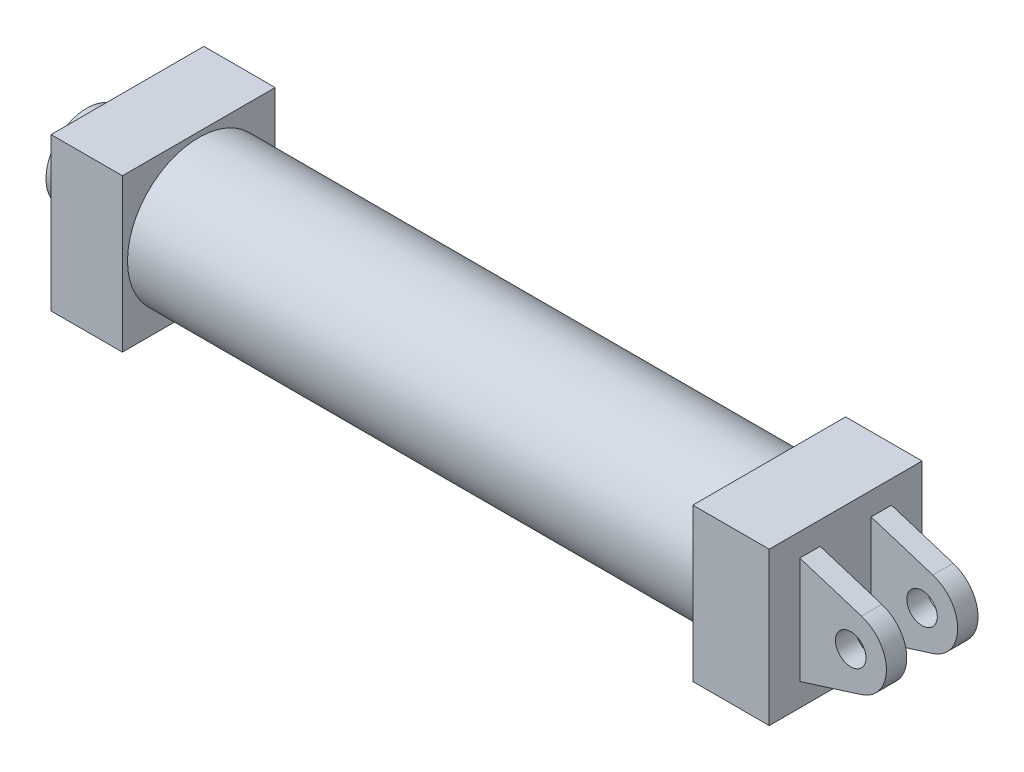
ISO-10303-21;
HEADER;
FILE_DESCRIPTION(('STEP AP214'),'2;1');
FILE_NAME('part.step','',(''),(''),'','','');
FILE_SCHEMA(('AUTOMOTIVE_DESIGN { 1 0 10303 214 1 1 1 1 }'));
ENDSEC;
DATA;
#1=APPLICATION_CONTEXT('core data for automotive mechanical design processes');
#2=APPLICATION_PROTOCOL_DEFINITION('international standard','automotive_design',2000,#1);
#3=PRODUCT_CONTEXT('',#1,'mechanical');
#4=PRODUCT('Part','Part','',(#3));
#5=PRODUCT_RELATED_PRODUCT_CATEGORY('part','',(#4));
#6=PRODUCT_DEFINITION_FORMATION('','',#4);
#7=PRODUCT_DEFINITION_CONTEXT('part definition',#1,'design');
#8=PRODUCT_DEFINITION('design','',#6,#7);
#9=PRODUCT_DEFINITION_SHAPE('','',#8);
#10=(LENGTH_UNIT() NAMED_UNIT(*) SI_UNIT(.MILLI.,.METRE.));
#11=(NAMED_UNIT(*) PLANE_ANGLE_UNIT() SI_UNIT($,.RADIAN.));
#12=(NAMED_UNIT(*) SI_UNIT($,.STERADIAN.) SOLID_ANGLE_UNIT());
#13=UNCERTAINTY_MEASURE_WITH_UNIT(LENGTH_MEASURE(1.E-05),#10,'distance_accuracy_value','');
#14=(GEOMETRIC_REPRESENTATION_CONTEXT(3) GLOBAL_UNCERTAINTY_ASSIGNED_CONTEXT((#13)) GLOBAL_UNIT_ASSIGNED_CONTEXT((#10,
#11,#12)) REPRESENTATION_CONTEXT('',''));
#15=CARTESIAN_POINT('',(0.,0.,0.));
#16=DIRECTION('',(0.,0.,1.));
#17=DIRECTION('',(1.,0.,0.));
#18=AXIS2_PLACEMENT_3D('',#15,#16,#17);
#19=CARTESIAN_POINT('',(31.75,0.,28.575));
#20=DIRECTION('',(0.,0.,-1.));
#21=DIRECTION('',(-1.,0.,0.));
#22=AXIS2_PLACEMENT_3D('',#19,#20,#21);
#23=CYLINDRICAL_SURFACE('',#22,22.225);
#24=DIRECTION('',(0.,0.,-1.));
#25=VECTOR('',#24,1.);
#26=CARTESIAN_POINT('',(38.4331863939825,-21.1963592303793,28.575));
#27=LINE('',#26,#25);
#28=CARTESIAN_POINT('',(38.4331863939825,-21.1963592303793,28.575));
#29=VERTEX_POINT('',#28);
#30=CARTESIAN_POINT('',(38.4331863939825,-21.1963592303793,15.875));
#31=VERTEX_POINT('',#30);
#32=EDGE_CURVE('E179',#29,#31,#27,.T.);
#33=ORIENTED_EDGE('',*,*,#32,.T.);
#34=CARTESIAN_POINT('',(31.75,0.,15.875));
#35=DIRECTION('',(0.,0.,-1.));
#36=DIRECTION('',(0.,1.,0.));
#37=AXIS2_PLACEMENT_3D('',#34,#35,#36);
#38=CIRCLE('',#37,22.225);
#39=CARTESIAN_POINT('',(38.4331863939825,21.1963592303793,15.875));
#40=VERTEX_POINT('',#39);
#41=EDGE_CURVE('E61',#40,#31,#38,.T.);
#42=ORIENTED_EDGE('',*,*,#41,.F.);
#43=DIRECTION('',(0.,0.,-1.));
#44=VECTOR('',#43,1.);
#45=CARTESIAN_POINT('',(38.4331863939825,21.1963592303793,28.575));
#46=LINE('',#45,#44);
#47=CARTESIAN_POINT('',(38.4331863939825,21.1963592303793,28.575));
#48=VERTEX_POINT('',#47);
#49=EDGE_CURVE('E184',#48,#40,#46,.T.);
#50=ORIENTED_EDGE('',*,*,#49,.F.);
#51=CARTESIAN_POINT('',(31.75,0.,28.575));
#52=DIRECTION('',(0.,0.,1.));
#53=DIRECTION('',(1.,0.,0.));
#54=AXIS2_PLACEMENT_3D('',#51,#52,#53);
#55=CIRCLE('',#54,22.225);
#56=EDGE_CURVE('E288',#29,#48,#55,.T.);
#57=ORIENTED_EDGE('',*,*,#56,.F.);
#58=EDGE_LOOP('',(#33,#42,#50,#57));
#59=FACE_BOUND('',#58,.T.);
#60=ADVANCED_FACE('F44',(#59),#23,.T.);
#61=CARTESIAN_POINT('',(38.4331863939825,21.1963592303793,28.575));
#62=DIRECTION('',(-0.300705799504274,-0.953716950748227,0.));
#63=DIRECTION('',(0.953716950748227,-0.300705799504273,0.));
#64=AXIS2_PLACEMENT_3D('',#61,#62,#63);
#65=PLANE('',#64);
#66=DIRECTION('',(0.953716950748227,-0.300705799504273,0.));
#67=VECTOR('',#66,1.);
#68=CARTESIAN_POINT('',(38.4331863939825,21.1963592303793,15.875));
#69=LINE('',#68,#67);
#70=CARTESIAN_POINT('',(0.,33.3142963531623,15.875));
#71=VERTEX_POINT('',#70);
#72=EDGE_CURVE('E271',#71,#40,#69,.T.);
#73=ORIENTED_EDGE('',*,*,#72,.F.);
#74=DIRECTION('',(0.,0.,-1.));
#75=VECTOR('',#74,1.);
#76=CARTESIAN_POINT('',(0.,33.3142963531623,28.575));
#77=LINE('',#76,#75);
#78=CARTESIAN_POINT('',(0.,33.3142963531623,28.575));
#79=VERTEX_POINT('',#78);
#80=EDGE_CURVE('E171',#79,#71,#77,.T.);
#81=ORIENTED_EDGE('',*,*,#80,.F.);
#82=DIRECTION('',(-0.953716950748227,0.300705799504273,0.));
#83=VECTOR('',#82,1.);
#84=CARTESIAN_POINT('',(38.4331863939825,21.1963592303793,28.575));
#85=LINE('',#84,#83);
#86=EDGE_CURVE('E291',#48,#79,#85,.T.);
#87=ORIENTED_EDGE('',*,*,#86,.F.);
#88=ORIENTED_EDGE('',*,*,#49,.T.);
#89=EDGE_LOOP('',(#73,#81,#87,#88));
#90=FACE_BOUND('',#89,.T.);
#91=ADVANCED_FACE('F329',(#90),#65,.F.);
#92=CARTESIAN_POINT('',(38.4331863939825,-21.1963592303793,28.575));
#93=DIRECTION('',(0.300705799504274,-0.953716950748227,0.));
#94=DIRECTION('',(0.953716950748227,0.300705799504273,0.));
#95=AXIS2_PLACEMENT_3D('',#92,#93,#94);
#96=PLANE('',#95);
#97=DIRECTION('',(0.,0.,-1.));
#98=VECTOR('',#97,1.);
#99=CARTESIAN_POINT('',(0.,-33.3142963531623,28.575));
#100=LINE('',#99,#98);
#101=CARTESIAN_POINT('',(0.,-33.3142963531623,28.575));
#102=VERTEX_POINT('',#101);
#103=CARTESIAN_POINT('',(0.,-33.3142963531623,15.875));
#104=VERTEX_POINT('',#103);
#105=EDGE_CURVE('E169',#102,#104,#100,.T.);
#106=ORIENTED_EDGE('',*,*,#105,.T.);
#107=DIRECTION('',(0.953716950748227,0.300705799504273,0.));
#108=VECTOR('',#107,1.);
#109=CARTESIAN_POINT('',(38.4331863939825,-21.1963592303793,15.875));
#110=LINE('',#109,#108);
#111=EDGE_CURVE('E156',#104,#31,#110,.T.);
#112=ORIENTED_EDGE('',*,*,#111,.T.);
#113=ORIENTED_EDGE('',*,*,#32,.F.);
#114=DIRECTION('',(-0.953716950748227,-0.300705799504273,0.));
#115=VECTOR('',#114,1.);
#116=CARTESIAN_POINT('',(38.4331863939825,-21.1963592303793,28.575));
#117=LINE('',#116,#115);
#118=EDGE_CURVE('E69',#29,#102,#117,.T.);
#119=ORIENTED_EDGE('',*,*,#118,.T.);
#120=EDGE_LOOP('',(#106,#112,#113,#119));
#121=FACE_BOUND('',#120,.T.);
#122=ADVANCED_FACE('F174',(#121),#96,.T.);
#123=CARTESIAN_POINT('',(31.75,0.,28.575));
#124=DIRECTION('',(0.,0.,-1.));
#125=DIRECTION('',(-1.,0.,0.));
#126=AXIS2_PLACEMENT_3D('',#123,#124,#125);
#127=CYLINDRICAL_SURFACE('',#126,9.525);
#128=CARTESIAN_POINT('',(31.75,0.,28.575));
#129=DIRECTION('',(0.,0.,1.));
#130=DIRECTION('',(1.,0.,0.));
#131=AXIS2_PLACEMENT_3D('',#128,#129,#130);
#132=CIRCLE('',#131,9.525);
#133=CARTESIAN_POINT('',(41.275,0.,28.575));
#134=VERTEX_POINT('',#133);
#135=EDGE_CURVE('E282',#134,#134,#132,.T.);
#136=ORIENTED_EDGE('',*,*,#135,.T.);
#137=EDGE_LOOP('',(#136));
#138=FACE_BOUND('',#137,.T.);
#139=CARTESIAN_POINT('',(31.75,0.,15.875));
#140=DIRECTION('',(0.,0.,-1.));
#141=DIRECTION('',(0.,1.,0.));
#142=AXIS2_PLACEMENT_3D('',#139,#140,#141);
#143=CIRCLE('',#142,9.525);
#144=CARTESIAN_POINT('',(31.75,9.525,15.875));
#145=VERTEX_POINT('',#144);
#146=EDGE_CURVE('E162',#145,#145,#143,.T.);
#147=ORIENTED_EDGE('',*,*,#146,.T.);
#148=EDGE_LOOP('',(#147));
#149=FACE_BOUND('',#148,.T.);
#150=ADVANCED_FACE('F336',(#138,#149),#127,.F.);
#151=CARTESIAN_POINT('',(0.,-47.625,47.625));
#152=DIRECTION('',(-1.,0.,0.));
#153=DIRECTION('',(0.,0.,1.));
#154=AXIS2_PLACEMENT_3D('',#151,#152,#153);
#155=PLANE('',#154);
#156=DIRECTION('',(0.,1.,0.));
#157=VECTOR('',#156,1.);
#158=CARTESIAN_POINT('',(0.,-47.625,-15.875));
#159=LINE('',#158,#157);
#160=CARTESIAN_POINT('',(0.,-33.3142963531622,-15.875));
#161=VERTEX_POINT('',#160);
#162=CARTESIAN_POINT('',(0.,33.3142963531622,-15.875));
#163=VERTEX_POINT('',#162);
#164=EDGE_CURVE('E172',#161,#163,#159,.T.);
#165=ORIENTED_EDGE('',*,*,#164,.T.);
#166=CARTESIAN_POINT('',(0.,33.3142963531623,-28.575));
#167=VERTEX_POINT('',#166);
#168=EDGE_CURVE('E175',#163,#167,#77,.T.);
#169=ORIENTED_EDGE('',*,*,#168,.T.);
#170=DIRECTION('',(0.,-1.,0.));
#171=VECTOR('',#170,1.);
#172=CARTESIAN_POINT('',(0.,33.3142963531623,-28.575));
#173=LINE('',#172,#171);
#174=CARTESIAN_POINT('',(0.,-33.3142963531623,-28.575));
#175=VERTEX_POINT('',#174);
#176=EDGE_CURVE('E303',#167,#175,#173,.T.);
#177=ORIENTED_EDGE('',*,*,#176,.T.);
#178=EDGE_CURVE('E176',#161,#175,#100,.T.);
#179=ORIENTED_EDGE('',*,*,#178,.F.);
#180=EDGE_LOOP('',(#165,#169,#177,#179));
#181=FACE_BOUND('',#180,.T.);
#182=DIRECTION('',(0.,1.,0.));
#183=VECTOR('',#182,1.);
#184=CARTESIAN_POINT('',(0.,-47.625,-47.625));
#185=LINE('',#184,#183);
#186=CARTESIAN_POINT('',(0.,-47.625,-47.625));
#187=VERTEX_POINT('',#186);
#188=CARTESIAN_POINT('',(0.,47.625,-47.625));
#189=VERTEX_POINT('',#188);
#190=EDGE_CURVE('E252',#187,#189,#185,.T.);
#191=ORIENTED_EDGE('',*,*,#190,.T.);
#192=DIRECTION('',(0.,0.,-1.));
#193=VECTOR('',#192,1.);
#194=CARTESIAN_POINT('',(0.,47.625,47.625));
#195=LINE('',#194,#193);
#196=CARTESIAN_POINT('',(0.,47.625,47.625));
#197=VERTEX_POINT('',#196);
#198=EDGE_CURVE('E240',#197,#189,#195,.T.);
#199=ORIENTED_EDGE('',*,*,#198,.F.);
#200=DIRECTION('',(0.,-1.,0.));
#201=VECTOR('',#200,1.);
#202=CARTESIAN_POINT('',(0.,47.625,47.625));
#203=LINE('',#202,#201);
#204=CARTESIAN_POINT('',(0.,-47.625,47.625));
#205=VERTEX_POINT('',#204);
#206=EDGE_CURVE('E233',#197,#205,#203,.T.);
#207=ORIENTED_EDGE('',*,*,#206,.T.);
#208=DIRECTION('',(0.,0.,1.));
#209=VECTOR('',#208,1.);
#210=CARTESIAN_POINT('',(0.,-47.625,-47.625));
#211=LINE('',#210,#209);
#212=EDGE_CURVE('E250',#187,#205,#211,.T.);
#213=ORIENTED_EDGE('',*,*,#212,.F.);
#214=EDGE_LOOP('',(#191,#199,#207,#213));
#215=FACE_BOUND('',#214,.T.);
#216=ORIENTED_EDGE('',*,*,#80,.T.);
#217=DIRECTION('',(0.,1.,0.));
#218=VECTOR('',#217,1.);
#219=CARTESIAN_POINT('',(0.,-47.625,15.875));
#220=LINE('',#219,#218);
#221=EDGE_CURVE('E159',#104,#71,#220,.T.);
#222=ORIENTED_EDGE('',*,*,#221,.F.);
#223=ORIENTED_EDGE('',*,*,#105,.F.);
#224=DIRECTION('',(0.,-1.,0.));
#225=VECTOR('',#224,1.);
#226=CARTESIAN_POINT('',(0.,33.3142963531623,28.575));
#227=LINE('',#226,#225);
#228=EDGE_CURVE('E294',#79,#102,#227,.T.);
#229=ORIENTED_EDGE('',*,*,#228,.F.);
#230=EDGE_LOOP('',(#216,#222,#223,#229));
#231=FACE_BOUND('',#230,.T.);
#232=ADVANCED_FACE('F167',(#181,#215,#231),#155,.F.);
#233=CARTESIAN_POINT('',(-447.675,-47.625,47.625));
#234=DIRECTION('',(-1.,0.,0.));
#235=DIRECTION('',(0.,0.,1.));
#236=AXIS2_PLACEMENT_3D('',#233,#234,#235);
#237=PLANE('',#236);
#238=DIRECTION('',(0.,0.,1.));
#239=VECTOR('',#238,1.);
#240=CARTESIAN_POINT('',(-447.675,-47.625,-47.625));
#241=LINE('',#240,#239);
#242=CARTESIAN_POINT('',(-447.675,-47.625,-47.625));
#243=VERTEX_POINT('',#242);
#244=CARTESIAN_POINT('',(-447.675,-47.625,47.625));
#245=VERTEX_POINT('',#244);
#246=EDGE_CURVE('E200',#243,#245,#241,.T.);
#247=ORIENTED_EDGE('',*,*,#246,.T.);
#248=DIRECTION('',(0.,1.,0.));
#249=VECTOR('',#248,1.);
#250=CARTESIAN_POINT('',(-447.675,-47.625,47.625));
#251=LINE('',#250,#249);
#252=CARTESIAN_POINT('',(-447.675,47.625,47.625));
#253=VERTEX_POINT('',#252);
#254=EDGE_CURVE('E203',#245,#253,#251,.T.);
#255=ORIENTED_EDGE('',*,*,#254,.T.);
#256=DIRECTION('',(0.,0.,-1.));
#257=VECTOR('',#256,1.);
#258=CARTESIAN_POINT('',(-447.675,47.625,47.625));
#259=LINE('',#258,#257);
#260=CARTESIAN_POINT('',(-447.675,47.625,-47.625));
#261=VERTEX_POINT('',#260);
#262=EDGE_CURVE('E206',#253,#261,#259,.T.);
#263=ORIENTED_EDGE('',*,*,#262,.T.);
#264=DIRECTION('',(0.,-1.,0.));
#265=VECTOR('',#264,1.);
#266=CARTESIAN_POINT('',(-447.675,47.625,-47.625));
#267=LINE('',#266,#265);
#268=EDGE_CURVE('E208',#261,#243,#267,.T.);
#269=ORIENTED_EDGE('',*,*,#268,.T.);
#270=EDGE_LOOP('',(#247,#255,#263,#269));
#271=FACE_BOUND('',#270,.T.);
#272=CARTESIAN_POINT('',(-447.675,0.,0.));
#273=DIRECTION('',(-1.,0.,0.));
#274=DIRECTION('',(0.,0.,1.));
#275=AXIS2_PLACEMENT_3D('',#272,#273,#274);
#276=CIRCLE('',#275,25.4);
#277=CARTESIAN_POINT('',(-447.675,0.,25.4));
#278=VERTEX_POINT('',#277);
#279=EDGE_CURVE('E193',#278,#278,#276,.T.);
#280=ORIENTED_EDGE('',*,*,#279,.F.);
#281=EDGE_LOOP('',(#280));
#282=FACE_BOUND('',#281,.T.);
#283=ADVANCED_FACE('F368',(#271,#282),#237,.T.);
#284=CARTESIAN_POINT('',(-47.625,-47.625,47.625));
#285=DIRECTION('',(-1.,0.,0.));
#286=DIRECTION('',(0.,0.,1.));
#287=AXIS2_PLACEMENT_3D('',#284,#285,#286);
#288=PLANE('',#287);
#289=DIRECTION('',(0.,-1.,0.));
#290=VECTOR('',#289,1.);
#291=CARTESIAN_POINT('',(-47.625,47.625,47.625));
#292=LINE('',#291,#290);
#293=CARTESIAN_POINT('',(-47.625,47.625,47.625));
#294=VERTEX_POINT('',#293);
#295=CARTESIAN_POINT('',(-47.625,-47.625,47.625));
#296=VERTEX_POINT('',#295);
#297=EDGE_CURVE('E236',#294,#296,#292,.T.);
#298=ORIENTED_EDGE('',*,*,#297,.F.);
#299=DIRECTION('',(0.,0.,-1.));
#300=VECTOR('',#299,1.);
#301=CARTESIAN_POINT('',(-47.625,47.625,47.625));
#302=LINE('',#301,#300);
#303=CARTESIAN_POINT('',(-47.625,47.625,-47.625));
#304=VERTEX_POINT('',#303);
#305=EDGE_CURVE('E245',#294,#304,#302,.T.);
#306=ORIENTED_EDGE('',*,*,#305,.T.);
#307=DIRECTION('',(0.,1.,0.));
#308=VECTOR('',#307,1.);
#309=CARTESIAN_POINT('',(-47.625,-47.625,-47.625));
#310=LINE('',#309,#308);
#311=CARTESIAN_POINT('',(-47.625,-47.625,-47.625));
#312=VERTEX_POINT('',#311);
#313=EDGE_CURVE('E242',#312,#304,#310,.T.);
#314=ORIENTED_EDGE('',*,*,#313,.F.);
#315=DIRECTION('',(0.,0.,1.));
#316=VECTOR('',#315,1.);
#317=CARTESIAN_POINT('',(-47.625,-47.625,-47.625));
#318=LINE('',#317,#316);
#319=EDGE_CURVE('E239',#312,#296,#318,.T.);
#320=ORIENTED_EDGE('',*,*,#319,.T.);
#321=EDGE_LOOP('',(#298,#306,#314,#320));
#322=FACE_BOUND('',#321,.T.);
#323=CARTESIAN_POINT('',(-47.625,0.,0.));
#324=DIRECTION('',(-1.,0.,0.));
#325=DIRECTION('',(0.,0.,1.));
#326=AXIS2_PLACEMENT_3D('',#323,#324,#325);
#327=CIRCLE('',#326,44.45);
#328=CARTESIAN_POINT('',(-47.625,0.,44.45));
#329=VERTEX_POINT('',#328);
#330=EDGE_CURVE('E229',#329,#329,#327,.T.);
#331=ORIENTED_EDGE('',*,*,#330,.F.);
#332=EDGE_LOOP('',(#331));
#333=FACE_BOUND('',#332,.T.);
#334=ADVANCED_FACE('F371',(#322,#333),#288,.T.);
#335=CARTESIAN_POINT('',(-47.625,47.625,47.625));
#336=DIRECTION('',(0.,0.,1.));
#337=DIRECTION('',(0.,-1.,0.));
#338=AXIS2_PLACEMENT_3D('',#335,#336,#337);
#339=PLANE('',#338);
#340=ORIENTED_EDGE('',*,*,#206,.F.);
#341=DIRECTION('',(1.,0.,0.));
#342=VECTOR('',#341,1.);
#343=CARTESIAN_POINT('',(-47.625,47.625,47.625));
#344=LINE('',#343,#342);
#345=EDGE_CURVE('E13',#294,#197,#344,.T.);
#346=ORIENTED_EDGE('',*,*,#345,.F.);
#347=ORIENTED_EDGE('',*,*,#297,.T.);
#348=DIRECTION('',(1.,0.,0.));
#349=VECTOR('',#348,1.);
#350=CARTESIAN_POINT('',(-47.625,-47.625,47.625));
#351=LINE('',#350,#349);
#352=EDGE_CURVE('E247',#296,#205,#351,.T.);
#353=ORIENTED_EDGE('',*,*,#352,.T.);
#354=EDGE_LOOP('',(#340,#346,#347,#353));
#355=FACE_BOUND('',#354,.T.);
#356=ADVANCED_FACE('F46',(#355),#339,.T.);
#357=CARTESIAN_POINT('',(-47.625,47.625,47.625));
#358=DIRECTION('',(0.,-1.,0.));
#359=DIRECTION('',(0.,0.,-1.));
#360=AXIS2_PLACEMENT_3D('',#357,#358,#359);
#361=PLANE('',#360);
#362=ORIENTED_EDGE('',*,*,#198,.T.);
#363=DIRECTION('',(1.,0.,0.));
#364=VECTOR('',#363,1.);
#365=CARTESIAN_POINT('',(-47.625,47.625,-47.625));
#366=LINE('',#365,#364);
#367=EDGE_CURVE('E53',#304,#189,#366,.T.);
#368=ORIENTED_EDGE('',*,*,#367,.F.);
#369=ORIENTED_EDGE('',*,*,#305,.F.);
#370=ORIENTED_EDGE('',*,*,#345,.T.);
#371=EDGE_LOOP('',(#362,#368,#369,#370));
#372=FACE_BOUND('',#371,.T.);
#373=ADVANCED_FACE('F402',(#372),#361,.F.);
#374=CARTESIAN_POINT('',(-47.625,-47.625,-47.625));
#375=DIRECTION('',(0.,0.,-1.));
#376=DIRECTION('',(0.,1.,0.));
#377=AXIS2_PLACEMENT_3D('',#374,#375,#376);
#378=PLANE('',#377);
#379=ORIENTED_EDGE('',*,*,#190,.F.);
#380=DIRECTION('',(1.,0.,0.));
#381=VECTOR('',#380,1.);
#382=CARTESIAN_POINT('',(-47.625,-47.625,-47.625));
#383=LINE('',#382,#381);
#384=EDGE_CURVE('E258',#312,#187,#383,.T.);
#385=ORIENTED_EDGE('',*,*,#384,.F.);
#386=ORIENTED_EDGE('',*,*,#313,.T.);
#387=ORIENTED_EDGE('',*,*,#367,.T.);
#388=EDGE_LOOP('',(#379,#385,#386,#387));
#389=FACE_BOUND('',#388,.T.);
#390=ADVANCED_FACE('F405',(#389),#378,.T.);
#391=CARTESIAN_POINT('',(-47.625,-47.625,-47.625));
#392=DIRECTION('',(0.,1.,0.));
#393=DIRECTION('',(0.,0.,1.));
#394=AXIS2_PLACEMENT_3D('',#391,#392,#393);
#395=PLANE('',#394);
#396=ORIENTED_EDGE('',*,*,#212,.T.);
#397=ORIENTED_EDGE('',*,*,#352,.F.);
#398=ORIENTED_EDGE('',*,*,#319,.F.);
#399=ORIENTED_EDGE('',*,*,#384,.T.);
#400=EDGE_LOOP('',(#396,#397,#398,#399));
#401=FACE_BOUND('',#400,.T.);
#402=ADVANCED_FACE('F395',(#401),#395,.F.);
#403=CARTESIAN_POINT('',(-403.225,0.,0.));
#404=DIRECTION('',(1.,0.,0.));
#405=DIRECTION('',(0.,0.,-1.));
#406=AXIS2_PLACEMENT_3D('',#403,#404,#405);
#407=CYLINDRICAL_SURFACE('',#406,44.45);
#408=CARTESIAN_POINT('',(-403.225,0.,0.));
#409=DIRECTION('',(-1.,0.,0.));
#410=DIRECTION('',(0.,0.,1.));
#411=AXIS2_PLACEMENT_3D('',#408,#409,#410);
#412=CIRCLE('',#411,44.45);
#413=CARTESIAN_POINT('',(-403.225,0.,44.45));
#414=VERTEX_POINT('',#413);
#415=EDGE_CURVE('E230',#414,#414,#412,.T.);
#416=ORIENTED_EDGE('',*,*,#415,.F.);
#417=EDGE_LOOP('',(#416));
#418=FACE_BOUND('',#417,.T.);
#419=ORIENTED_EDGE('',*,*,#330,.T.);
#420=EDGE_LOOP('',(#419));
#421=FACE_BOUND('',#420,.T.);
#422=ADVANCED_FACE('F377',(#418,#421),#407,.T.);
#423=CARTESIAN_POINT('',(-403.225,-47.625,47.625));
#424=DIRECTION('',(-1.,0.,0.));
#425=DIRECTION('',(0.,0.,1.));
#426=AXIS2_PLACEMENT_3D('',#423,#424,#425);
#427=PLANE('',#426);
#428=DIRECTION('',(0.,0.,1.));
#429=VECTOR('',#428,1.);
#430=CARTESIAN_POINT('',(-403.225,-47.625,-47.625));
#431=LINE('',#430,#429);
#432=CARTESIAN_POINT('',(-403.225,-47.625,-47.625));
#433=VERTEX_POINT('',#432);
#434=CARTESIAN_POINT('',(-403.225,-47.625,47.625));
#435=VERTEX_POINT('',#434);
#436=EDGE_CURVE('E197',#433,#435,#431,.T.);
#437=ORIENTED_EDGE('',*,*,#436,.F.);
#438=DIRECTION('',(0.,-1.,0.));
#439=VECTOR('',#438,1.);
#440=CARTESIAN_POINT('',(-403.225,47.625,-47.625));
#441=LINE('',#440,#439);
#442=CARTESIAN_POINT('',(-403.225,47.625,-47.625));
#443=VERTEX_POINT('',#442);
#444=EDGE_CURVE('E204',#443,#433,#441,.T.);
#445=ORIENTED_EDGE('',*,*,#444,.F.);
#446=DIRECTION('',(0.,0.,-1.));
#447=VECTOR('',#446,1.);
#448=CARTESIAN_POINT('',(-403.225,47.625,47.625));
#449=LINE('',#448,#447);
#450=CARTESIAN_POINT('',(-403.225,47.625,47.625));
#451=VERTEX_POINT('',#450);
#452=EDGE_CURVE('E215',#451,#443,#449,.T.);
#453=ORIENTED_EDGE('',*,*,#452,.F.);
#454=DIRECTION('',(0.,1.,0.));
#455=VECTOR('',#454,1.);
#456=CARTESIAN_POINT('',(-403.225,-47.625,47.625));
#457=LINE('',#456,#455);
#458=EDGE_CURVE('E213',#435,#451,#457,.T.);
#459=ORIENTED_EDGE('',*,*,#458,.F.);
#460=EDGE_LOOP('',(#437,#445,#453,#459));
#461=FACE_BOUND('',#460,.T.);
#462=ORIENTED_EDGE('',*,*,#415,.T.);
#463=EDGE_LOOP('',(#462));
#464=FACE_BOUND('',#463,.T.);
#465=ADVANCED_FACE('F373',(#461,#464),#427,.F.);
#466=CARTESIAN_POINT('',(-447.675,-47.625,-47.625));
#467=DIRECTION('',(0.,1.,0.));
#468=DIRECTION('',(0.,0.,1.));
#469=AXIS2_PLACEMENT_3D('',#466,#467,#468);
#470=PLANE('',#469);
#471=ORIENTED_EDGE('',*,*,#436,.T.);
#472=DIRECTION('',(1.,0.,0.));
#473=VECTOR('',#472,1.);
#474=CARTESIAN_POINT('',(-447.675,-47.625,47.625));
#475=LINE('',#474,#473);
#476=EDGE_CURVE('E226',#245,#435,#475,.T.);
#477=ORIENTED_EDGE('',*,*,#476,.F.);
#478=ORIENTED_EDGE('',*,*,#246,.F.);
#479=DIRECTION('',(1.,0.,0.));
#480=VECTOR('',#479,1.);
#481=CARTESIAN_POINT('',(-447.675,-47.625,-47.625));
#482=LINE('',#481,#480);
#483=EDGE_CURVE('E210',#243,#433,#482,.T.);
#484=ORIENTED_EDGE('',*,*,#483,.T.);
#485=EDGE_LOOP('',(#471,#477,#478,#484));
#486=FACE_BOUND('',#485,.T.);
#487=ADVANCED_FACE('F376',(#486),#470,.F.);
#488=CARTESIAN_POINT('',(-447.675,-47.625,47.625));
#489=DIRECTION('',(0.,0.,-1.));
#490=DIRECTION('',(0.,1.,0.));
#491=AXIS2_PLACEMENT_3D('',#488,#489,#490);
#492=PLANE('',#491);
#493=ORIENTED_EDGE('',*,*,#458,.T.);
#494=DIRECTION('',(1.,0.,0.));
#495=VECTOR('',#494,1.);
#496=CARTESIAN_POINT('',(-447.675,47.625,47.625));
#497=LINE('',#496,#495);
#498=EDGE_CURVE('E223',#253,#451,#497,.T.);
#499=ORIENTED_EDGE('',*,*,#498,.F.);
#500=ORIENTED_EDGE('',*,*,#254,.F.);
#501=ORIENTED_EDGE('',*,*,#476,.T.);
#502=EDGE_LOOP('',(#493,#499,#500,#501));
#503=FACE_BOUND('',#502,.T.);
#504=ADVANCED_FACE('F385',(#503),#492,.F.);
#505=CARTESIAN_POINT('',(-447.675,47.625,47.625));
#506=DIRECTION('',(0.,-1.,0.));
#507=DIRECTION('',(0.,0.,-1.));
#508=AXIS2_PLACEMENT_3D('',#505,#506,#507);
#509=PLANE('',#508);
#510=ORIENTED_EDGE('',*,*,#452,.T.);
#511=DIRECTION('',(1.,0.,0.));
#512=VECTOR('',#511,1.);
#513=CARTESIAN_POINT('',(-447.675,47.625,-47.625));
#514=LINE('',#513,#512);
#515=EDGE_CURVE('E220',#261,#443,#514,.T.);
#516=ORIENTED_EDGE('',*,*,#515,.F.);
#517=ORIENTED_EDGE('',*,*,#262,.F.);
#518=ORIENTED_EDGE('',*,*,#498,.T.);
#519=EDGE_LOOP('',(#510,#516,#517,#518));
#520=FACE_BOUND('',#519,.T.);
#521=ADVANCED_FACE('F381',(#520),#509,.F.);
#522=CARTESIAN_POINT('',(-447.675,47.625,-47.625));
#523=DIRECTION('',(0.,0.,1.));
#524=DIRECTION('',(0.,-1.,0.));
#525=AXIS2_PLACEMENT_3D('',#522,#523,#524);
#526=PLANE('',#525);
#527=ORIENTED_EDGE('',*,*,#444,.T.);
#528=ORIENTED_EDGE('',*,*,#483,.F.);
#529=ORIENTED_EDGE('',*,*,#268,.F.);
#530=ORIENTED_EDGE('',*,*,#515,.T.);
#531=EDGE_LOOP('',(#527,#528,#529,#530));
#532=FACE_BOUND('',#531,.T.);
#533=ADVANCED_FACE('F366',(#532),#526,.F.);
#534=CARTESIAN_POINT('',(-473.075,0.,0.));
#535=DIRECTION('',(1.,0.,0.));
#536=DIRECTION('',(0.,0.,-1.));
#537=AXIS2_PLACEMENT_3D('',#534,#535,#536);
#538=CYLINDRICAL_SURFACE('',#537,25.4);
#539=CARTESIAN_POINT('',(-473.075,0.,0.));
#540=DIRECTION('',(-1.,0.,0.));
#541=DIRECTION('',(0.,0.,1.));
#542=AXIS2_PLACEMENT_3D('',#539,#540,#541);
#543=CIRCLE('',#542,25.4);
#544=CARTESIAN_POINT('',(-473.075,0.,25.4));
#545=VERTEX_POINT('',#544);
#546=EDGE_CURVE('E194',#545,#545,#543,.T.);
#547=ORIENTED_EDGE('',*,*,#546,.F.);
#548=EDGE_LOOP('',(#547));
#549=FACE_BOUND('',#548,.T.);
#550=ORIENTED_EDGE('',*,*,#279,.T.);
#551=EDGE_LOOP('',(#550));
#552=FACE_BOUND('',#551,.T.);
#553=ADVANCED_FACE('F362',(#549,#552),#538,.T.);
#554=CARTESIAN_POINT('',(-473.075,0.,0.));
#555=DIRECTION('',(-1.,0.,0.));
#556=DIRECTION('',(0.,0.,1.));
#557=AXIS2_PLACEMENT_3D('',#554,#555,#556);
#558=PLANE('',#557);
#559=CARTESIAN_POINT('',(-473.075,0.,0.));
#560=DIRECTION('',(-1.,0.,0.));
#561=DIRECTION('',(0.,0.,1.));
#562=AXIS2_PLACEMENT_3D('',#559,#560,#561);
#563=CIRCLE('',#562,17.4625);
#564=CARTESIAN_POINT('',(-473.075,0.,17.4625));
#565=VERTEX_POINT('',#564);
#566=EDGE_CURVE('E187',#565,#565,#563,.T.);
#567=ORIENTED_EDGE('',*,*,#566,.F.);
#568=EDGE_LOOP('',(#567));
#569=FACE_BOUND('',#568,.T.);
#570=ORIENTED_EDGE('',*,*,#546,.T.);
#571=EDGE_LOOP('',(#570));
#572=FACE_BOUND('',#571,.T.);
#573=ADVANCED_FACE('F358',(#569,#572),#558,.T.);
#574=CARTESIAN_POINT('',(1.76640866588029,0.,0.));
#575=DIRECTION('',(-1.,0.,0.));
#576=DIRECTION('',(0.,0.,1.));
#577=AXIS2_PLACEMENT_3D('',#574,#575,#576);
#578=CYLINDRICAL_SURFACE('',#577,17.4625);
#579=CARTESIAN_POINT('',(-47.625,0.,0.));
#580=DIRECTION('',(-1.,0.,0.));
#581=DIRECTION('',(0.,0.,1.));
#582=AXIS2_PLACEMENT_3D('',#579,#580,#581);
#583=CIRCLE('',#582,17.4625);
#584=CARTESIAN_POINT('',(-47.625,0.,17.4625));
#585=VERTEX_POINT('',#584);
#586=EDGE_CURVE('E190',#585,#585,#583,.F.);
#587=CARTESIAN_POINT('',(-47.625,0.,17.4625));
#588=CARTESIAN_POINT('',(-52.0567708333333,0.,17.4625));
#589=CARTESIAN_POINT('',(-56.4885416666666,0.,17.4625));
#590=CARTESIAN_POINT('',(-65.3520833333333,0.,17.4625));
#591=CARTESIAN_POINT('',(-69.7838541666666,0.,17.4625));
#592=CARTESIAN_POINT('',(-78.6473958333333,0.,17.4625));
#593=CARTESIAN_POINT('',(-83.0791666666667,0.,17.4625));
#594=CARTESIAN_POINT('',(-91.9427083333333,0.,17.4625));
#595=CARTESIAN_POINT('',(-96.3744791666666,0.,17.4625));
#596=CARTESIAN_POINT('',(-105.238020833333,0.,17.4625));
#597=CARTESIAN_POINT('',(-109.669791666667,0.,17.4625));
#598=CARTESIAN_POINT('',(-118.533333333333,0.,17.4625));
#599=CARTESIAN_POINT('',(-122.965104166667,0.,17.4625));
#600=CARTESIAN_POINT('',(-131.828645833333,0.,17.4625));
#601=CARTESIAN_POINT('',(-136.260416666667,0.,17.4625));
#602=CARTESIAN_POINT('',(-145.123958333333,0.,17.4625));
#603=CARTESIAN_POINT('',(-149.555729166667,0.,17.4625));
#604=CARTESIAN_POINT('',(-158.419270833333,0.,17.4625));
#605=CARTESIAN_POINT('',(-162.851041666667,0.,17.4625));
#606=CARTESIAN_POINT('',(-171.714583333333,0.,17.4625));
#607=CARTESIAN_POINT('',(-176.146354166667,0.,17.4625));
#608=CARTESIAN_POINT('',(-185.009895833333,0.,17.4625));
#609=CARTESIAN_POINT('',(-189.441666666667,0.,17.4625));
#610=CARTESIAN_POINT('',(-198.305208333333,0.,17.4625));
#611=CARTESIAN_POINT('',(-202.736979166667,0.,17.4625));
#612=CARTESIAN_POINT('',(-211.600520833333,0.,17.4625));
#613=CARTESIAN_POINT('',(-216.032291666667,0.,17.4625));
#614=CARTESIAN_POINT('',(-224.895833333333,0.,17.4625));
#615=CARTESIAN_POINT('',(-229.327604166667,0.,17.4625));
#616=CARTESIAN_POINT('',(-238.191145833333,0.,17.4625));
#617=CARTESIAN_POINT('',(-242.622916666667,0.,17.4625));
#618=CARTESIAN_POINT('',(-251.486458333333,0.,17.4625));
#619=CARTESIAN_POINT('',(-255.918229166667,0.,17.4625));
#620=CARTESIAN_POINT('',(-264.781770833333,0.,17.4625));
#621=CARTESIAN_POINT('',(-269.213541666667,0.,17.4625));
#622=CARTESIAN_POINT('',(-278.077083333333,0.,17.4625));
#623=CARTESIAN_POINT('',(-282.508854166667,0.,17.4625));
#624=CARTESIAN_POINT('',(-291.372395833333,0.,17.4625));
#625=CARTESIAN_POINT('',(-295.804166666667,0.,17.4625));
#626=CARTESIAN_POINT('',(-304.667708333333,0.,17.4625));
#627=CARTESIAN_POINT('',(-309.099479166667,0.,17.4625));
#628=CARTESIAN_POINT('',(-317.963020833333,0.,17.4625));
#629=CARTESIAN_POINT('',(-322.394791666667,0.,17.4625));
#630=CARTESIAN_POINT('',(-331.258333333333,0.,17.4625));
#631=CARTESIAN_POINT('',(-335.690104166667,0.,17.4625));
#632=CARTESIAN_POINT('',(-344.553645833333,0.,17.4625));
#633=CARTESIAN_POINT('',(-348.985416666667,0.,17.4625));
#634=CARTESIAN_POINT('',(-357.848958333333,0.,17.4625));
#635=CARTESIAN_POINT('',(-362.280729166667,0.,17.4625));
#636=CARTESIAN_POINT('',(-371.144270833333,0.,17.4625));
#637=CARTESIAN_POINT('',(-375.576041666667,0.,17.4625));
#638=CARTESIAN_POINT('',(-384.439583333333,0.,17.4625));
#639=CARTESIAN_POINT('',(-388.871354166666,0.,17.4625));
#640=CARTESIAN_POINT('',(-397.734895833333,0.,17.4625));
#641=CARTESIAN_POINT('',(-402.166666666667,0.,17.4625));
#642=CARTESIAN_POINT('',(-411.030208333333,0.,17.4625));
#643=CARTESIAN_POINT('',(-415.461979166667,0.,17.4625));
#644=CARTESIAN_POINT('',(-424.325520833333,0.,17.4625));
#645=CARTESIAN_POINT('',(-428.757291666667,0.,17.4625));
#646=CARTESIAN_POINT('',(-437.620833333333,0.,17.4625));
#647=CARTESIAN_POINT('',(-442.052604166667,0.,17.4625));
#648=CARTESIAN_POINT('',(-450.916145833333,0.,17.4625));
#649=CARTESIAN_POINT('',(-455.347916666666,0.,17.4625));
#650=CARTESIAN_POINT('',(-464.211458333333,0.,17.4625));
#651=CARTESIAN_POINT('',(-468.643229166667,0.,17.4625));
#652=CARTESIAN_POINT('',(-473.075,0.,17.4625));
#653=B_SPLINE_CURVE_WITH_KNOTS('',3,(#587,#588,#589,#590,#591,#592,#593,#594,#595,#596,#597,
#598,#599,#600,#601,#602,#603,#604,#605,#606,#607,#608,#609,#610,#611,#612,#613,#614,#615,#616,
#617,#618,#619,#620,#621,#622,#623,#624,#625,#626,#627,#628,#629,#630,#631,#632,#633,#634,#635,
#636,#637,#638,#639,#640,#641,#642,#643,#644,#645,#646,#647,#648,#649,#650,#651,#652),
.UNSPECIFIED.,.F.,.F.,(4,2,2,2,2,2,2,2,2,2,2,2,2,2,2,2,2,2,2,2,2,2,2,2,2,2,2,2,2,2,2,2,4),(0.,
13.2953125,26.590625,39.8859375,53.18125,66.4765625,79.771875,93.0671875,106.3625,119.6578125,
132.953125,146.2484375,159.54375,172.8390625,186.134375,199.4296875,212.725,226.0203125,
239.315625,252.6109375,265.90625,279.2015625,292.496875,305.7921875,319.0875,332.3828125,
345.678125,358.9734375,372.26875,385.5640625,398.859375,412.1546875,425.45),.UNSPECIFIED.);
#654=EDGE_CURVE('BSEAM354',#585,#565,#653,.T.);
#655=ORIENTED_EDGE('',*,*,#586,.T.);
#656=ORIENTED_EDGE('',*,*,#566,.T.);
#657=ORIENTED_EDGE('',*,*,#654,.T.);
#658=ORIENTED_EDGE('',*,*,#654,.F.);
#659=EDGE_LOOP('',(#655,#657,#656,#658));
#660=FACE_BOUND('',#659,.T.);
#661=ADVANCED_FACE('F354',(#660),#578,.F.);
#662=CARTESIAN_POINT('',(-47.625,-47.625,47.625));
#663=DIRECTION('',(-1.,0.,0.));
#664=DIRECTION('',(0.,0.,1.));
#665=AXIS2_PLACEMENT_3D('',#662,#663,#664);
#666=PLANE('',#665);
#667=ORIENTED_EDGE('',*,*,#586,.F.);
#668=EDGE_LOOP('',(#667));
#669=FACE_BOUND('',#668,.T.);
#670=ADVANCED_FACE('F351',(#669),#666,.T.);
#671=CARTESIAN_POINT('',(31.75,0.,28.575));
#672=DIRECTION('',(0.,0.,1.));
#673=DIRECTION('',(1.,0.,0.));
#674=AXIS2_PLACEMENT_3D('',#671,#672,#673);
#675=PLANE('',#674);
#676=ORIENTED_EDGE('',*,*,#56,.T.);
#677=ORIENTED_EDGE('',*,*,#86,.T.);
#678=ORIENTED_EDGE('',*,*,#228,.T.);
#679=ORIENTED_EDGE('',*,*,#118,.F.);
#680=EDGE_LOOP('',(#676,#677,#678,#679));
#681=FACE_BOUND('',#680,.T.);
#682=ORIENTED_EDGE('',*,*,#135,.F.);
#683=EDGE_LOOP('',(#682));
#684=FACE_BOUND('',#683,.T.);
#685=ADVANCED_FACE('F326',(#681,#684),#675,.T.);
#686=CARTESIAN_POINT('',(31.75,0.,-28.575));
#687=DIRECTION('',(0.,0.,1.));
#688=DIRECTION('',(1.,0.,0.));
#689=AXIS2_PLACEMENT_3D('',#686,#687,#688);
#690=PLANE('',#689);
#691=CARTESIAN_POINT('',(31.75,0.,-28.575));
#692=DIRECTION('',(0.,0.,1.));
#693=DIRECTION('',(1.,0.,0.));
#694=AXIS2_PLACEMENT_3D('',#691,#692,#693);
#695=CIRCLE('',#694,22.225);
#696=CARTESIAN_POINT('',(38.4331863939825,-21.1963592303793,-28.575));
#697=VERTEX_POINT('',#696);
#698=CARTESIAN_POINT('',(38.4331863939825,21.1963592303793,-28.575));
#699=VERTEX_POINT('',#698);
#700=EDGE_CURVE('E285',#697,#699,#695,.T.);
#701=ORIENTED_EDGE('',*,*,#700,.F.);
#702=DIRECTION('',(-0.953716950748227,-0.300705799504273,0.));
#703=VECTOR('',#702,1.);
#704=CARTESIAN_POINT('',(38.4331863939825,-21.1963592303793,-28.575));
#705=LINE('',#704,#703);
#706=EDGE_CURVE('E292',#697,#175,#705,.T.);
#707=ORIENTED_EDGE('',*,*,#706,.T.);
#708=ORIENTED_EDGE('',*,*,#176,.F.);
#709=DIRECTION('',(-0.953716950748227,0.300705799504273,0.));
#710=VECTOR('',#709,1.);
#711=CARTESIAN_POINT('',(38.4331863939825,21.1963592303793,-28.575));
#712=LINE('',#711,#710);
#713=EDGE_CURVE('E300',#699,#167,#712,.T.);
#714=ORIENTED_EDGE('',*,*,#713,.F.);
#715=EDGE_LOOP('',(#701,#707,#708,#714));
#716=FACE_BOUND('',#715,.T.);
#717=CARTESIAN_POINT('',(31.75,0.,-28.575));
#718=DIRECTION('',(0.,0.,1.));
#719=DIRECTION('',(1.,0.,0.));
#720=AXIS2_PLACEMENT_3D('',#717,#718,#719);
#721=CIRCLE('',#720,9.525);
#722=CARTESIAN_POINT('',(41.275,0.,-28.575));
#723=VERTEX_POINT('',#722);
#724=EDGE_CURVE('E281',#723,#723,#721,.T.);
#725=ORIENTED_EDGE('',*,*,#724,.T.);
#726=EDGE_LOOP('',(#725));
#727=FACE_BOUND('',#726,.T.);
#728=ADVANCED_FACE('F310',(#716,#727),#690,.F.);
#729=CARTESIAN_POINT('',(31.75,0.,-15.875));
#730=DIRECTION('',(0.,0.,-1.));
#731=DIRECTION('',(-1.,0.,0.));
#732=AXIS2_PLACEMENT_3D('',#729,#730,#731);
#733=CIRCLE('',#732,22.225);
#734=CARTESIAN_POINT('',(38.4331863939825,21.1963592303793,-15.875));
#735=VERTEX_POINT('',#734);
#736=CARTESIAN_POINT('',(38.4331863939825,-21.1963592303793,-15.875));
#737=VERTEX_POINT('',#736);
#738=EDGE_CURVE('E276',#735,#737,#733,.T.);
#739=ORIENTED_EDGE('',*,*,#738,.T.);
#740=EDGE_CURVE('E297',#737,#697,#27,.T.);
#741=ORIENTED_EDGE('',*,*,#740,.T.);
#742=ORIENTED_EDGE('',*,*,#700,.T.);
#743=EDGE_CURVE('E183',#735,#699,#46,.T.);
#744=ORIENTED_EDGE('',*,*,#743,.F.);
#745=EDGE_LOOP('',(#739,#741,#742,#744));
#746=FACE_BOUND('',#745,.T.);
#747=ADVANCED_FACE('F320',(#746),#23,.T.);
#748=ORIENTED_EDGE('',*,*,#168,.F.);
#749=DIRECTION('',(0.953716950748227,-0.300705799504273,0.));
#750=VECTOR('',#749,1.);
#751=CARTESIAN_POINT('',(38.4331863939825,21.1963592303793,-15.875));
#752=LINE('',#751,#750);
#753=EDGE_CURVE('E278',#163,#735,#752,.T.);
#754=ORIENTED_EDGE('',*,*,#753,.T.);
#755=ORIENTED_EDGE('',*,*,#743,.T.);
#756=ORIENTED_EDGE('',*,*,#713,.T.);
#757=EDGE_LOOP('',(#748,#754,#755,#756));
#758=FACE_BOUND('',#757,.T.);
#759=ADVANCED_FACE('F317',(#758),#65,.F.);
#760=DIRECTION('',(0.953716950748227,0.300705799504273,0.));
#761=VECTOR('',#760,1.);
#762=CARTESIAN_POINT('',(38.4331863939825,-21.1963592303793,-15.875));
#763=LINE('',#762,#761);
#764=EDGE_CURVE('E273',#161,#737,#763,.T.);
#765=ORIENTED_EDGE('',*,*,#764,.F.);
#766=ORIENTED_EDGE('',*,*,#178,.T.);
#767=ORIENTED_EDGE('',*,*,#706,.F.);
#768=ORIENTED_EDGE('',*,*,#740,.F.);
#769=EDGE_LOOP('',(#765,#766,#767,#768));
#770=FACE_BOUND('',#769,.T.);
#771=ADVANCED_FACE('F338',(#770),#96,.T.);
#772=CARTESIAN_POINT('',(31.75,0.,-15.875));
#773=DIRECTION('',(0.,0.,-1.));
#774=DIRECTION('',(-1.,0.,0.));
#775=AXIS2_PLACEMENT_3D('',#772,#773,#774);
#776=CIRCLE('',#775,9.525);
#777=CARTESIAN_POINT('',(22.225,0.,-15.875));
#778=VERTEX_POINT('',#777);
#779=EDGE_CURVE('E48',#778,#778,#776,.T.);
#780=ORIENTED_EDGE('',*,*,#779,.F.);
#781=EDGE_LOOP('',(#780));
#782=FACE_BOUND('',#781,.T.);
#783=ORIENTED_EDGE('',*,*,#724,.F.);
#784=EDGE_LOOP('',(#783));
#785=FACE_BOUND('',#784,.T.);
#786=ADVANCED_FACE('F345',(#782,#785),#127,.F.);
#787=CARTESIAN_POINT('',(53.975,-47.625,-15.875));
#788=DIRECTION('',(0.,0.,-1.));
#789=DIRECTION('',(-1.,0.,0.));
#790=AXIS2_PLACEMENT_3D('',#787,#788,#789);
#791=PLANE('',#790);
#792=ORIENTED_EDGE('',*,*,#779,.T.);
#793=EDGE_LOOP('',(#792));
#794=FACE_BOUND('',#793,.T.);
#795=ORIENTED_EDGE('',*,*,#164,.F.);
#796=ORIENTED_EDGE('',*,*,#764,.T.);
#797=ORIENTED_EDGE('',*,*,#738,.F.);
#798=ORIENTED_EDGE('',*,*,#753,.F.);
#799=EDGE_LOOP('',(#795,#796,#797,#798));
#800=FACE_BOUND('',#799,.T.);
#801=ADVANCED_FACE('F566',(#794,#800),#791,.F.);
#802=CARTESIAN_POINT('',(53.975,-47.625,15.875));
#803=DIRECTION('',(0.,0.,-1.));
#804=DIRECTION('',(0.,1.,0.));
#805=AXIS2_PLACEMENT_3D('',#802,#803,#804);
#806=PLANE('',#805);
#807=ORIENTED_EDGE('',*,*,#146,.F.);
#808=EDGE_LOOP('',(#807));
#809=FACE_BOUND('',#808,.T.);
#810=ORIENTED_EDGE('',*,*,#72,.T.);
#811=ORIENTED_EDGE('',*,*,#41,.T.);
#812=ORIENTED_EDGE('',*,*,#111,.F.);
#813=ORIENTED_EDGE('',*,*,#221,.T.);
#814=EDGE_LOOP('',(#810,#811,#812,#813));
#815=FACE_BOUND('',#814,.T.);
#816=ADVANCED_FACE('F158',(#809,#815),#806,.T.);
#817=CLOSED_SHELL('',(#60,#91,#122,#150,#232,#283,#334,#356,#373,#390,#402,#422,#465,#487,#504,
#521,#533,#553,#573,#661,#670,#685,#728,#747,#759,#771,#786,#801,#816));
#818=MANIFOLD_SOLID_BREP('B2',#817);
#819=ADVANCED_BREP_SHAPE_REPRESENTATION('',(#18,#818),#14);
#820=SHAPE_DEFINITION_REPRESENTATION(#9,#819);
ENDSEC;
END-ISO-10303-21;
